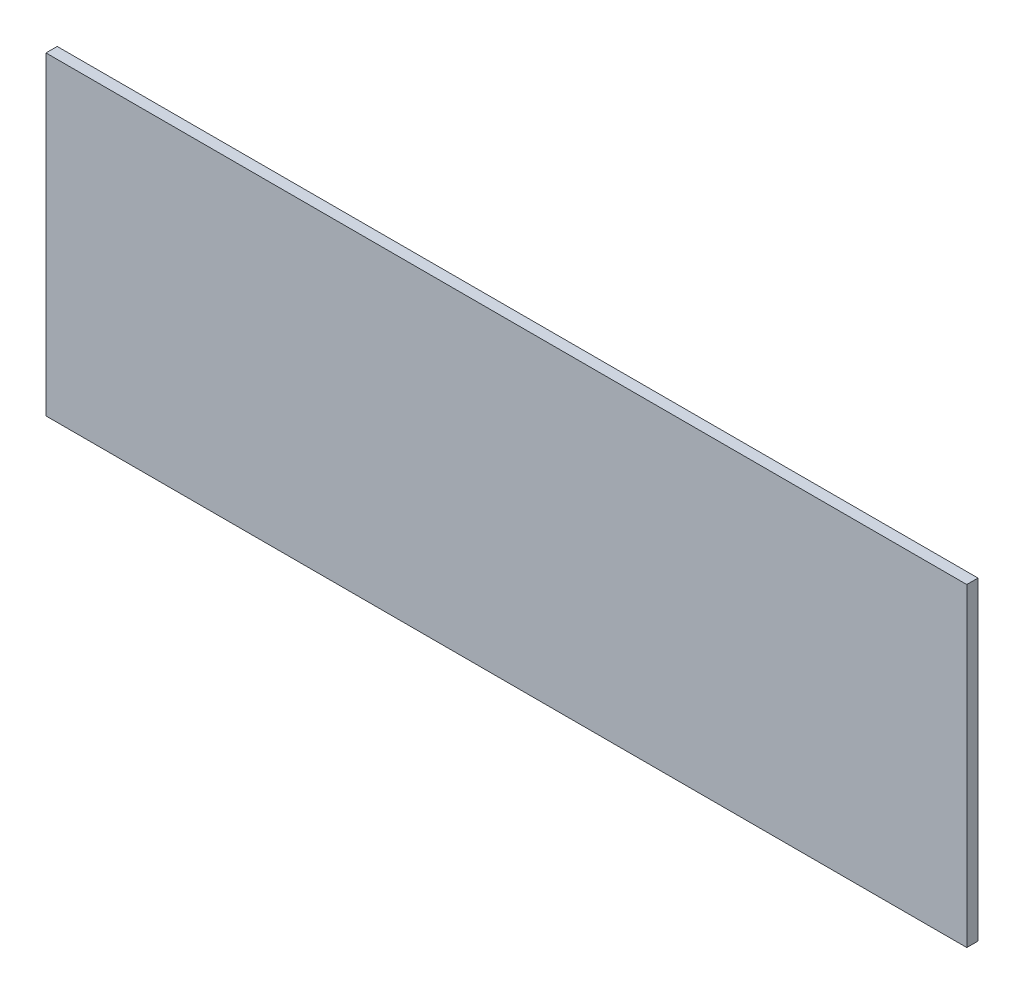
ISO-10303-21;
HEADER;
FILE_DESCRIPTION(('STEP AP214'),'2;1');
FILE_NAME('part.step','',(''),(''),'','','');
FILE_SCHEMA(('AUTOMOTIVE_DESIGN { 1 0 10303 214 1 1 1 1 }'));
ENDSEC;
DATA;
#1=APPLICATION_CONTEXT('core data for automotive mechanical design processes');
#2=APPLICATION_PROTOCOL_DEFINITION('international standard','automotive_design',2000,#1);
#3=PRODUCT_CONTEXT('',#1,'mechanical');
#4=PRODUCT('Part','Part','',(#3));
#5=PRODUCT_RELATED_PRODUCT_CATEGORY('part','',(#4));
#6=PRODUCT_DEFINITION_FORMATION('','',#4);
#7=PRODUCT_DEFINITION_CONTEXT('part definition',#1,'design');
#8=PRODUCT_DEFINITION('design','',#6,#7);
#9=PRODUCT_DEFINITION_SHAPE('','',#8);
#10=(LENGTH_UNIT() NAMED_UNIT(*) SI_UNIT(.MILLI.,.METRE.));
#11=(NAMED_UNIT(*) PLANE_ANGLE_UNIT() SI_UNIT($,.RADIAN.));
#12=(NAMED_UNIT(*) SI_UNIT($,.STERADIAN.) SOLID_ANGLE_UNIT());
#13=UNCERTAINTY_MEASURE_WITH_UNIT(LENGTH_MEASURE(1.E-05),#10,'distance_accuracy_value','');
#14=(GEOMETRIC_REPRESENTATION_CONTEXT(3) GLOBAL_UNCERTAINTY_ASSIGNED_CONTEXT((#13)) GLOBAL_UNIT_ASSIGNED_CONTEXT((#10,
#11,#12)) REPRESENTATION_CONTEXT('',''));
#15=CARTESIAN_POINT('',(0.,0.,0.));
#16=DIRECTION('',(0.,0.,1.));
#17=DIRECTION('',(1.,0.,0.));
#18=AXIS2_PLACEMENT_3D('',#15,#16,#17);
#19=CARTESIAN_POINT('',(-69.2801317233809,161.507142857143,5.));
#20=DIRECTION('',(1.,0.,0.));
#21=DIRECTION('',(0.,1.,0.));
#22=AXIS2_PLACEMENT_3D('',#19,#20,#21);
#23=PLANE('',#22);
#24=DIRECTION('',(0.,-1.,0.));
#25=VECTOR('',#24,1.);
#26=CARTESIAN_POINT('',(-69.2801317233809,161.507142857143,0.));
#27=LINE('',#26,#25);
#28=CARTESIAN_POINT('',(-69.2801317233809,161.507142857143,0.));
#29=VERTEX_POINT('',#28);
#30=CARTESIAN_POINT('',(-69.2801317233809,21.5071428571429,0.));
#31=VERTEX_POINT('',#30);
#32=EDGE_CURVE('E96',#29,#31,#27,.T.);
#33=ORIENTED_EDGE('',*,*,#32,.T.);
#34=DIRECTION('',(0.,0.,-1.));
#35=VECTOR('',#34,1.);
#36=CARTESIAN_POINT('',(-69.2801317233809,21.5071428571429,5.));
#37=LINE('',#36,#35);
#38=CARTESIAN_POINT('',(-69.2801317233809,21.5071428571429,5.));
#39=VERTEX_POINT('',#38);
#40=EDGE_CURVE('E11',#39,#31,#37,.T.);
#41=ORIENTED_EDGE('',*,*,#40,.F.);
#42=DIRECTION('',(0.,-1.,0.));
#43=VECTOR('',#42,1.);
#44=CARTESIAN_POINT('',(-69.2801317233809,161.507142857143,5.));
#45=LINE('',#44,#43);
#46=CARTESIAN_POINT('',(-69.2801317233809,161.507142857143,5.));
#47=VERTEX_POINT('',#46);
#48=EDGE_CURVE('E84',#47,#39,#45,.T.);
#49=ORIENTED_EDGE('',*,*,#48,.F.);
#50=DIRECTION('',(0.,0.,-1.));
#51=VECTOR('',#50,1.);
#52=CARTESIAN_POINT('',(-69.2801317233809,161.507142857143,5.));
#53=LINE('',#52,#51);
#54=EDGE_CURVE('E92',#47,#29,#53,.T.);
#55=ORIENTED_EDGE('',*,*,#54,.T.);
#56=EDGE_LOOP('',(#33,#41,#49,#55));
#57=FACE_BOUND('',#56,.T.);
#58=ADVANCED_FACE('F33',(#57),#23,.F.);
#59=CARTESIAN_POINT('',(-69.2801317233809,21.5071428571429,5.));
#60=DIRECTION('',(0.,1.,0.));
#61=DIRECTION('',(0.,0.,1.));
#62=AXIS2_PLACEMENT_3D('',#59,#60,#61);
#63=PLANE('',#62);
#64=DIRECTION('',(1.,0.,0.));
#65=VECTOR('',#64,1.);
#66=CARTESIAN_POINT('',(-69.2801317233809,21.5071428571429,0.));
#67=LINE('',#66,#65);
#68=CARTESIAN_POINT('',(340.719868276619,21.5071428571429,0.));
#69=VERTEX_POINT('',#68);
#70=EDGE_CURVE('E88',#31,#69,#67,.T.);
#71=ORIENTED_EDGE('',*,*,#70,.T.);
#72=DIRECTION('',(0.,0.,-1.));
#73=VECTOR('',#72,1.);
#74=CARTESIAN_POINT('',(340.719868276619,21.5071428571429,5.));
#75=LINE('',#74,#73);
#76=CARTESIAN_POINT('',(340.719868276619,21.5071428571429,5.));
#77=VERTEX_POINT('',#76);
#78=EDGE_CURVE('E41',#77,#69,#75,.T.);
#79=ORIENTED_EDGE('',*,*,#78,.F.);
#80=DIRECTION('',(1.,0.,0.));
#81=VECTOR('',#80,1.);
#82=CARTESIAN_POINT('',(-69.2801317233809,21.5071428571429,5.));
#83=LINE('',#82,#81);
#84=EDGE_CURVE('E79',#39,#77,#83,.T.);
#85=ORIENTED_EDGE('',*,*,#84,.F.);
#86=ORIENTED_EDGE('',*,*,#40,.T.);
#87=EDGE_LOOP('',(#71,#79,#85,#86));
#88=FACE_BOUND('',#87,.T.);
#89=ADVANCED_FACE('F87',(#88),#63,.F.);
#90=CARTESIAN_POINT('',(340.719868276619,161.507142857143,5.));
#91=DIRECTION('',(-1.,0.,0.));
#92=DIRECTION('',(0.,0.,1.));
#93=AXIS2_PLACEMENT_3D('',#90,#91,#92);
#94=PLANE('',#93);
#95=DIRECTION('',(0.,1.,0.));
#96=VECTOR('',#95,1.);
#97=CARTESIAN_POINT('',(340.719868276619,161.507142857143,0.));
#98=LINE('',#97,#96);
#99=CARTESIAN_POINT('',(340.719868276619,161.507142857143,0.));
#100=VERTEX_POINT('',#99);
#101=EDGE_CURVE('E66',#69,#100,#98,.T.);
#102=ORIENTED_EDGE('',*,*,#101,.T.);
#103=DIRECTION('',(0.,0.,-1.));
#104=VECTOR('',#103,1.);
#105=CARTESIAN_POINT('',(340.719868276619,161.507142857143,5.));
#106=LINE('',#105,#104);
#107=CARTESIAN_POINT('',(340.719868276619,161.507142857143,5.));
#108=VERTEX_POINT('',#107);
#109=EDGE_CURVE('E89',#108,#100,#106,.T.);
#110=ORIENTED_EDGE('',*,*,#109,.F.);
#111=DIRECTION('',(0.,1.,0.));
#112=VECTOR('',#111,1.);
#113=CARTESIAN_POINT('',(340.719868276619,161.507142857143,5.));
#114=LINE('',#113,#112);
#115=EDGE_CURVE('E82',#77,#108,#114,.T.);
#116=ORIENTED_EDGE('',*,*,#115,.F.);
#117=ORIENTED_EDGE('',*,*,#78,.T.);
#118=EDGE_LOOP('',(#102,#110,#116,#117));
#119=FACE_BOUND('',#118,.T.);
#120=ADVANCED_FACE('F90',(#119),#94,.F.);
#121=CARTESIAN_POINT('',(-69.2801317233809,161.507142857143,5.));
#122=DIRECTION('',(0.,-1.,0.));
#123=DIRECTION('',(0.,0.,-1.));
#124=AXIS2_PLACEMENT_3D('',#121,#122,#123);
#125=PLANE('',#124);
#126=DIRECTION('',(-1.,0.,0.));
#127=VECTOR('',#126,1.);
#128=CARTESIAN_POINT('',(-69.2801317233809,161.507142857143,0.));
#129=LINE('',#128,#127);
#130=EDGE_CURVE('E72',#100,#29,#129,.T.);
#131=ORIENTED_EDGE('',*,*,#130,.T.);
#132=ORIENTED_EDGE('',*,*,#54,.F.);
#133=DIRECTION('',(-1.,0.,0.));
#134=VECTOR('',#133,1.);
#135=CARTESIAN_POINT('',(-69.2801317233809,161.507142857143,5.));
#136=LINE('',#135,#134);
#137=EDGE_CURVE('E49',#108,#47,#136,.T.);
#138=ORIENTED_EDGE('',*,*,#137,.F.);
#139=ORIENTED_EDGE('',*,*,#109,.T.);
#140=EDGE_LOOP('',(#131,#132,#138,#139));
#141=FACE_BOUND('',#140,.T.);
#142=ADVANCED_FACE('F103',(#141),#125,.F.);
#143=CARTESIAN_POINT('',(0.,0.,5.));
#144=DIRECTION('',(0.,0.,1.));
#145=DIRECTION('',(1.,0.,0.));
#146=AXIS2_PLACEMENT_3D('',#143,#144,#145);
#147=PLANE('',#146);
#148=ORIENTED_EDGE('',*,*,#48,.T.);
#149=ORIENTED_EDGE('',*,*,#84,.T.);
#150=ORIENTED_EDGE('',*,*,#115,.T.);
#151=ORIENTED_EDGE('',*,*,#137,.T.);
#152=EDGE_LOOP('',(#148,#149,#150,#151));
#153=FACE_BOUND('',#152,.T.);
#154=ADVANCED_FACE('F80',(#153),#147,.T.);
#155=CARTESIAN_POINT('',(0.,0.,0.));
#156=DIRECTION('',(0.,0.,1.));
#157=DIRECTION('',(1.,0.,0.));
#158=AXIS2_PLACEMENT_3D('',#155,#156,#157);
#159=PLANE('',#158);
#160=ORIENTED_EDGE('',*,*,#32,.F.);
#161=ORIENTED_EDGE('',*,*,#130,.F.);
#162=ORIENTED_EDGE('',*,*,#101,.F.);
#163=ORIENTED_EDGE('',*,*,#70,.F.);
#164=EDGE_LOOP('',(#160,#161,#162,#163));
#165=FACE_BOUND('',#164,.T.);
#166=ADVANCED_FACE('F106',(#165),#159,.F.);
#167=CLOSED_SHELL('',(#58,#89,#120,#142,#154,#166));
#168=MANIFOLD_SOLID_BREP('B2',#167);
#169=ADVANCED_BREP_SHAPE_REPRESENTATION('',(#18,#168),#14);
#170=SHAPE_DEFINITION_REPRESENTATION(#9,#169);
ENDSEC;
END-ISO-10303-21;
